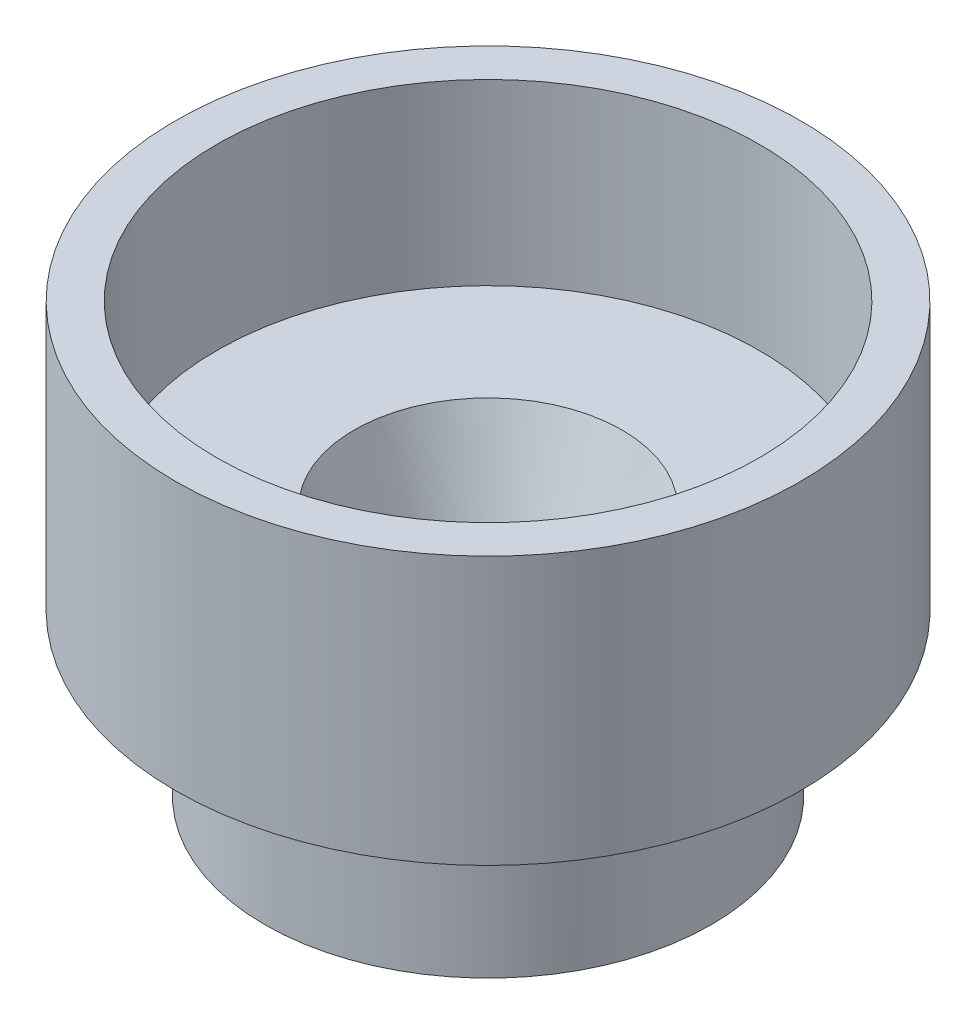
ISO-10303-21;
HEADER;
FILE_DESCRIPTION(('STEP AP214'),'2;1');
FILE_NAME('part.step','',(''),(''),'','','');
FILE_SCHEMA(('AUTOMOTIVE_DESIGN { 1 0 10303 214 1 1 1 1 }'));
ENDSEC;
DATA;
#1=APPLICATION_CONTEXT('core data for automotive mechanical design processes');
#2=APPLICATION_PROTOCOL_DEFINITION('international standard','automotive_design',2000,#1);
#3=PRODUCT_CONTEXT('',#1,'mechanical');
#4=PRODUCT('Part','Part','',(#3));
#5=PRODUCT_RELATED_PRODUCT_CATEGORY('part','',(#4));
#6=PRODUCT_DEFINITION_FORMATION('','',#4);
#7=PRODUCT_DEFINITION_CONTEXT('part definition',#1,'design');
#8=PRODUCT_DEFINITION('design','',#6,#7);
#9=PRODUCT_DEFINITION_SHAPE('','',#8);
#10=(LENGTH_UNIT() NAMED_UNIT(*) SI_UNIT(.MILLI.,.METRE.));
#11=(NAMED_UNIT(*) PLANE_ANGLE_UNIT() SI_UNIT($,.RADIAN.));
#12=(NAMED_UNIT(*) SI_UNIT($,.STERADIAN.) SOLID_ANGLE_UNIT());
#13=UNCERTAINTY_MEASURE_WITH_UNIT(LENGTH_MEASURE(1.E-05),#10,'distance_accuracy_value','');
#14=(GEOMETRIC_REPRESENTATION_CONTEXT(3) GLOBAL_UNCERTAINTY_ASSIGNED_CONTEXT((#13)) GLOBAL_UNIT_ASSIGNED_CONTEXT((#10,
#11,#12)) REPRESENTATION_CONTEXT('',''));
#15=CARTESIAN_POINT('',(0.,0.,0.));
#16=DIRECTION('',(0.,0.,1.));
#17=DIRECTION('',(1.,0.,0.));
#18=AXIS2_PLACEMENT_3D('',#15,#16,#17);
#19=CARTESIAN_POINT('',(0.,-4.5,0.));
#20=DIRECTION('',(0.,1.,0.));
#21=DIRECTION('',(0.,0.,1.));
#22=AXIS2_PLACEMENT_3D('',#19,#20,#21);
#23=CYLINDRICAL_SURFACE('',#22,3.75);
#24=CARTESIAN_POINT('',(0.,-4.5,0.));
#25=DIRECTION('',(0.,-1.,0.));
#26=DIRECTION('',(0.,0.,-1.));
#27=AXIS2_PLACEMENT_3D('',#24,#25,#26);
#28=CIRCLE('',#27,3.75);
#29=CARTESIAN_POINT('',(0.,-4.5,-3.75));
#30=VERTEX_POINT('',#29);
#31=EDGE_CURVE('E77',#30,#30,#28,.T.);
#32=ORIENTED_EDGE('',*,*,#31,.T.);
#33=EDGE_LOOP('',(#32));
#34=FACE_BOUND('',#33,.T.);
#35=CARTESIAN_POINT('',(0.,-1.5,0.));
#36=DIRECTION('',(0.,1.,0.));
#37=DIRECTION('',(0.,0.,1.));
#38=AXIS2_PLACEMENT_3D('',#35,#36,#37);
#39=CIRCLE('',#38,3.75);
#40=CARTESIAN_POINT('',(0.,-1.5,3.75));
#41=VERTEX_POINT('',#40);
#42=EDGE_CURVE('E81',#41,#41,#39,.T.);
#43=ORIENTED_EDGE('',*,*,#42,.T.);
#44=EDGE_LOOP('',(#43));
#45=FACE_BOUND('',#44,.T.);
#46=ADVANCED_FACE('F45',(#34,#45),#23,.F.);
#47=CARTESIAN_POINT('',(0.,7.5,0.));
#48=DIRECTION('',(0.,1.,0.));
#49=DIRECTION('',(0.,0.,1.));
#50=AXIS2_PLACEMENT_3D('',#47,#48,#49);
#51=PLANE('',#50);
#52=CARTESIAN_POINT('',(0.,7.5,0.));
#53=DIRECTION('',(0.,1.,0.));
#54=DIRECTION('',(0.,0.,1.));
#55=AXIS2_PLACEMENT_3D('',#52,#53,#54);
#56=CIRCLE('',#55,8.75);
#57=CARTESIAN_POINT('',(0.,7.5,8.75));
#58=VERTEX_POINT('',#57);
#59=EDGE_CURVE('E59',#58,#58,#56,.T.);
#60=ORIENTED_EDGE('',*,*,#59,.T.);
#61=EDGE_LOOP('',(#60));
#62=FACE_BOUND('',#61,.T.);
#63=CARTESIAN_POINT('',(0.,7.5,0.));
#64=DIRECTION('',(0.,1.,0.));
#65=DIRECTION('',(0.,0.,1.));
#66=AXIS2_PLACEMENT_3D('',#63,#64,#65);
#67=CIRCLE('',#66,7.6);
#68=CARTESIAN_POINT('',(0.,7.5,7.6));
#69=VERTEX_POINT('',#68);
#70=EDGE_CURVE('E66',#69,#69,#67,.T.);
#71=ORIENTED_EDGE('',*,*,#70,.F.);
#72=EDGE_LOOP('',(#71));
#73=FACE_BOUND('',#72,.T.);
#74=ADVANCED_FACE('F113',(#62,#73),#51,.T.);
#75=CARTESIAN_POINT('',(0.,0.,0.));
#76=DIRECTION('',(0.,1.,0.));
#77=DIRECTION('',(0.,0.,1.));
#78=AXIS2_PLACEMENT_3D('',#75,#76,#77);
#79=PLANE('',#78);
#80=CARTESIAN_POINT('',(0.,0.,0.));
#81=DIRECTION('',(0.,1.,0.));
#82=DIRECTION('',(0.,0.,1.));
#83=AXIS2_PLACEMENT_3D('',#80,#81,#82);
#84=CIRCLE('',#83,6.25);
#85=CARTESIAN_POINT('',(0.,0.,6.25));
#86=VERTEX_POINT('',#85);
#87=EDGE_CURVE('E11',#86,#86,#84,.F.);
#88=ORIENTED_EDGE('',*,*,#87,.F.);
#89=EDGE_LOOP('',(#88));
#90=FACE_BOUND('',#89,.T.);
#91=CARTESIAN_POINT('',(0.,0.,0.));
#92=DIRECTION('',(0.,1.,0.));
#93=DIRECTION('',(0.,0.,1.));
#94=AXIS2_PLACEMENT_3D('',#91,#92,#93);
#95=CIRCLE('',#94,8.75);
#96=CARTESIAN_POINT('',(0.,0.,8.75));
#97=VERTEX_POINT('',#96);
#98=EDGE_CURVE('E62',#97,#97,#95,.T.);
#99=ORIENTED_EDGE('',*,*,#98,.F.);
#100=EDGE_LOOP('',(#99));
#101=FACE_BOUND('',#100,.T.);
#102=ADVANCED_FACE('F115',(#90,#101),#79,.F.);
#103=CARTESIAN_POINT('',(0.,7.5,0.));
#104=DIRECTION('',(0.,-1.,0.));
#105=DIRECTION('',(0.,0.,-1.));
#106=AXIS2_PLACEMENT_3D('',#103,#104,#105);
#107=CYLINDRICAL_SURFACE('',#106,8.75);
#108=ORIENTED_EDGE('',*,*,#59,.F.);
#109=EDGE_LOOP('',(#108));
#110=FACE_BOUND('',#109,.T.);
#111=ORIENTED_EDGE('',*,*,#98,.T.);
#112=EDGE_LOOP('',(#111));
#113=FACE_BOUND('',#112,.T.);
#114=ADVANCED_FACE('F47',(#110,#113),#107,.T.);
#115=CARTESIAN_POINT('',(0.,7.5,0.));
#116=DIRECTION('',(0.,-1.,0.));
#117=DIRECTION('',(0.,0.,-1.));
#118=AXIS2_PLACEMENT_3D('',#115,#116,#117);
#119=CYLINDRICAL_SURFACE('',#118,7.6);
#120=CARTESIAN_POINT('',(0.,2.5,0.));
#121=DIRECTION('',(0.,1.,0.));
#122=DIRECTION('',(0.,0.,1.));
#123=AXIS2_PLACEMENT_3D('',#120,#121,#122);
#124=CIRCLE('',#123,7.6);
#125=CARTESIAN_POINT('',(0.,2.5,7.6));
#126=VERTEX_POINT('',#125);
#127=EDGE_CURVE('E54',#126,#126,#124,.T.);
#128=ORIENTED_EDGE('',*,*,#127,.F.);
#129=EDGE_LOOP('',(#128));
#130=FACE_BOUND('',#129,.T.);
#131=ORIENTED_EDGE('',*,*,#70,.T.);
#132=EDGE_LOOP('',(#131));
#133=FACE_BOUND('',#132,.T.);
#134=ADVANCED_FACE('F104',(#130,#133),#119,.F.);
#135=CARTESIAN_POINT('',(0.,2.5,0.));
#136=DIRECTION('',(0.,1.,0.));
#137=DIRECTION('',(0.,0.,1.));
#138=AXIS2_PLACEMENT_3D('',#135,#136,#137);
#139=PLANE('',#138);
#140=CARTESIAN_POINT('',(0.,2.5,0.));
#141=DIRECTION('',(0.,1.,0.));
#142=DIRECTION('',(0.,0.,1.));
#143=AXIS2_PLACEMENT_3D('',#140,#141,#142);
#144=CIRCLE('',#143,3.75);
#145=CARTESIAN_POINT('',(0.,2.5,3.75));
#146=VERTEX_POINT('',#145);
#147=EDGE_CURVE('E49',#146,#146,#144,.T.);
#148=ORIENTED_EDGE('',*,*,#147,.F.);
#149=EDGE_LOOP('',(#148));
#150=FACE_BOUND('',#149,.T.);
#151=ORIENTED_EDGE('',*,*,#127,.T.);
#152=EDGE_LOOP('',(#151));
#153=FACE_BOUND('',#152,.T.);
#154=ADVANCED_FACE('F100',(#150,#153),#139,.T.);
#155=CARTESIAN_POINT('',(0.,-4.5,0.));
#156=DIRECTION('',(0.,-1.,0.));
#157=DIRECTION('',(0.,0.,-1.));
#158=AXIS2_PLACEMENT_3D('',#155,#156,#157);
#159=PLANE('',#158);
#160=CARTESIAN_POINT('',(0.,-4.5,0.));
#161=DIRECTION('',(0.,-1.,0.));
#162=DIRECTION('',(0.,0.,-1.));
#163=AXIS2_PLACEMENT_3D('',#160,#161,#162);
#164=CIRCLE('',#163,6.25);
#165=CARTESIAN_POINT('',(0.,-4.5,-6.25));
#166=VERTEX_POINT('',#165);
#167=EDGE_CURVE('E73',#166,#166,#164,.T.);
#168=ORIENTED_EDGE('',*,*,#167,.T.);
#169=EDGE_LOOP('',(#168));
#170=FACE_BOUND('',#169,.T.);
#171=ORIENTED_EDGE('',*,*,#31,.F.);
#172=EDGE_LOOP('',(#171));
#173=FACE_BOUND('',#172,.T.);
#174=ADVANCED_FACE('F103',(#170,#173),#159,.T.);
#175=CARTESIAN_POINT('',(0.,-4.5,0.));
#176=DIRECTION('',(0.,1.,0.));
#177=DIRECTION('',(0.,0.,1.));
#178=AXIS2_PLACEMENT_3D('',#175,#176,#177);
#179=CYLINDRICAL_SURFACE('',#178,6.25);
#180=ORIENTED_EDGE('',*,*,#167,.F.);
#181=EDGE_LOOP('',(#180));
#182=FACE_BOUND('',#181,.T.);
#183=ORIENTED_EDGE('',*,*,#87,.T.);
#184=EDGE_LOOP('',(#183));
#185=FACE_BOUND('',#184,.T.);
#186=ADVANCED_FACE('F126',(#182,#185),#179,.T.);
#187=CARTESIAN_POINT('',(0.,-1.5,0.));
#188=DIRECTION('',(0.,1.,0.));
#189=DIRECTION('',(0.,0.,1.));
#190=AXIS2_PLACEMENT_3D('',#187,#188,#189);
#191=PLANE('',#190);
#192=ORIENTED_EDGE('',*,*,#42,.F.);
#193=EDGE_LOOP('',(#192));
#194=FACE_BOUND('',#193,.T.);
#195=CARTESIAN_POINT('',(0.,-1.5,0.));
#196=DIRECTION('',(0.,1.,0.));
#197=DIRECTION('',(0.,0.,1.));
#198=AXIS2_PLACEMENT_3D('',#195,#196,#197);
#199=CIRCLE('',#198,2.25);
#200=CARTESIAN_POINT('',(0.,-1.5,2.25));
#201=VERTEX_POINT('',#200);
#202=EDGE_CURVE('E85',#201,#201,#199,.T.);
#203=ORIENTED_EDGE('',*,*,#202,.T.);
#204=EDGE_LOOP('',(#203));
#205=FACE_BOUND('',#204,.T.);
#206=ADVANCED_FACE('F90',(#194,#205),#191,.F.);
#207=CARTESIAN_POINT('',(0.,2.5,0.));
#208=DIRECTION('',(0.,1.,0.));
#209=DIRECTION('',(0.,0.,1.));
#210=AXIS2_PLACEMENT_3D('',#207,#208,#209);
#211=CONICAL_SURFACE('',#210,3.75,0.358770670270572);
#212=ORIENTED_EDGE('',*,*,#202,.F.);
#213=EDGE_LOOP('',(#212));
#214=FACE_BOUND('',#213,.T.);
#215=ORIENTED_EDGE('',*,*,#147,.T.);
#216=EDGE_LOOP('',(#215));
#217=FACE_BOUND('',#216,.T.);
#218=ADVANCED_FACE('F92',(#214,#217),#211,.F.);
#219=CLOSED_SHELL('',(#46,#74,#102,#114,#134,#154,#174,#186,#206,#218));
#220=MANIFOLD_SOLID_BREP('B2',#219);
#221=ADVANCED_BREP_SHAPE_REPRESENTATION('',(#18,#220),#14);
#222=SHAPE_DEFINITION_REPRESENTATION(#9,#221);
ENDSEC;
END-ISO-10303-21;
